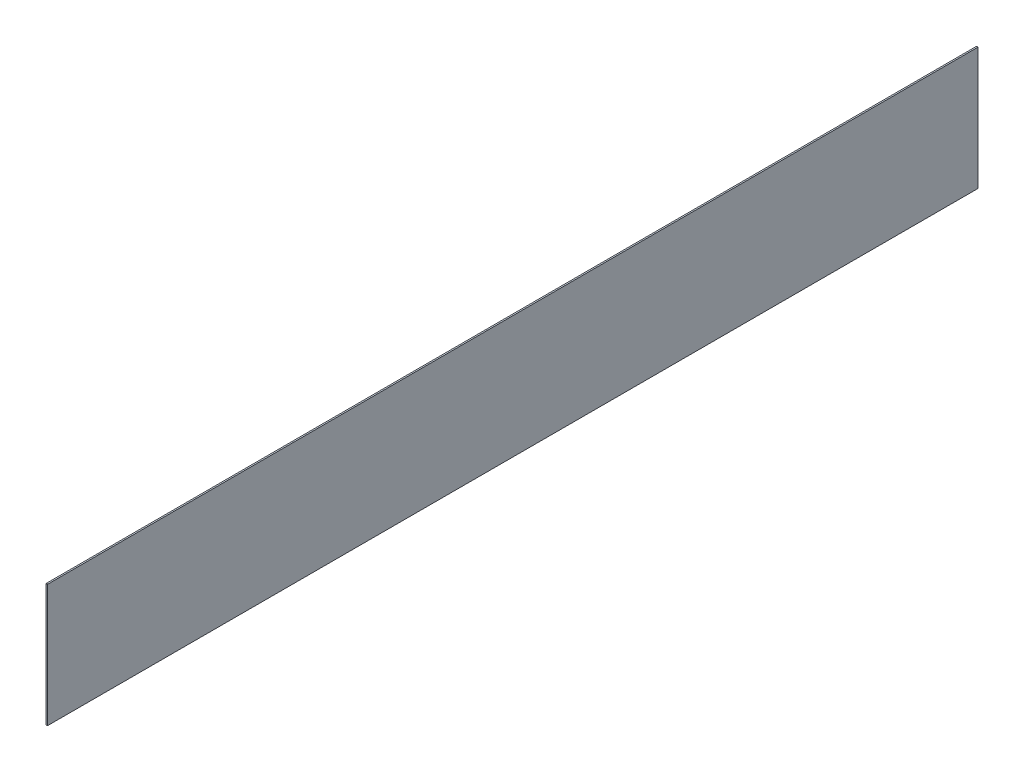
ISO-10303-21;
HEADER;
FILE_DESCRIPTION(('STEP AP214'),'2;1');
FILE_NAME('part.step','',(''),(''),'','','');
FILE_SCHEMA(('AUTOMOTIVE_DESIGN { 1 0 10303 214 1 1 1 1 }'));
ENDSEC;
DATA;
#1=APPLICATION_CONTEXT('core data for automotive mechanical design processes');
#2=APPLICATION_PROTOCOL_DEFINITION('international standard','automotive_design',2000,#1);
#3=PRODUCT_CONTEXT('',#1,'mechanical');
#4=PRODUCT('Part','Part','',(#3));
#5=PRODUCT_RELATED_PRODUCT_CATEGORY('part','',(#4));
#6=PRODUCT_DEFINITION_FORMATION('','',#4);
#7=PRODUCT_DEFINITION_CONTEXT('part definition',#1,'design');
#8=PRODUCT_DEFINITION('design','',#6,#7);
#9=PRODUCT_DEFINITION_SHAPE('','',#8);
#10=(LENGTH_UNIT() NAMED_UNIT(*) SI_UNIT(.MILLI.,.METRE.));
#11=(NAMED_UNIT(*) PLANE_ANGLE_UNIT() SI_UNIT($,.RADIAN.));
#12=(NAMED_UNIT(*) SI_UNIT($,.STERADIAN.) SOLID_ANGLE_UNIT());
#13=UNCERTAINTY_MEASURE_WITH_UNIT(LENGTH_MEASURE(1.E-05),#10,'distance_accuracy_value','');
#14=(GEOMETRIC_REPRESENTATION_CONTEXT(3) GLOBAL_UNCERTAINTY_ASSIGNED_CONTEXT((#13)) GLOBAL_UNIT_ASSIGNED_CONTEXT((#10,
#11,#12)) REPRESENTATION_CONTEXT('',''));
#15=CARTESIAN_POINT('',(0.,0.,0.));
#16=DIRECTION('',(0.,0.,1.));
#17=DIRECTION('',(1.,0.,0.));
#18=AXIS2_PLACEMENT_3D('',#15,#16,#17);
#19=CARTESIAN_POINT('',(-95.25,-60.325,-742.95457183542));
#20=DIRECTION('',(-1.,0.,0.));
#21=DIRECTION('',(0.,0.,1.));
#22=AXIS2_PLACEMENT_3D('',#19,#20,#21);
#23=PLANE('',#22);
#24=DIRECTION('',(0.,0.,1.));
#25=VECTOR('',#24,1.);
#26=CARTESIAN_POINT('',(-95.25,-60.325,-742.95457183542));
#27=LINE('',#26,#25);
#28=CARTESIAN_POINT('',(-95.25,-60.325,-679.45));
#29=VERTEX_POINT('',#28);
#30=CARTESIAN_POINT('',(-95.25,-60.325,-196.85));
#31=VERTEX_POINT('',#30);
#32=EDGE_CURVE('E11',#29,#31,#27,.T.);
#33=ORIENTED_EDGE('',*,*,#32,.F.);
#34=DIRECTION('',(0.,1.,0.));
#35=VECTOR('',#34,1.);
#36=CARTESIAN_POINT('',(-95.25,-60.325,-679.45));
#37=LINE('',#36,#35);
#38=CARTESIAN_POINT('',(-95.25,-123.825,-679.45));
#39=VERTEX_POINT('',#38);
#40=EDGE_CURVE('E76',#39,#29,#37,.T.);
#41=ORIENTED_EDGE('',*,*,#40,.F.);
#42=DIRECTION('',(0.,0.,1.));
#43=VECTOR('',#42,1.);
#44=CARTESIAN_POINT('',(-95.25,-123.825,-742.95457183542));
#45=LINE('',#44,#43);
#46=CARTESIAN_POINT('',(-95.25,-123.825,-196.85));
#47=VERTEX_POINT('',#46);
#48=EDGE_CURVE('E37',#39,#47,#45,.T.);
#49=ORIENTED_EDGE('',*,*,#48,.T.);
#50=DIRECTION('',(0.,-1.,0.));
#51=VECTOR('',#50,1.);
#52=CARTESIAN_POINT('',(-95.25,-60.325,-196.85));
#53=LINE('',#52,#51);
#54=EDGE_CURVE('E78',#31,#47,#53,.T.);
#55=ORIENTED_EDGE('',*,*,#54,.F.);
#56=EDGE_LOOP('',(#33,#41,#49,#55));
#57=FACE_BOUND('',#56,.T.);
#58=ADVANCED_FACE('F34',(#57),#23,.T.);
#59=CARTESIAN_POINT('',(-95.25,-60.325,-742.95457183542));
#60=DIRECTION('',(0.,-1.,0.));
#61=DIRECTION('',(0.,0.,-1.));
#62=AXIS2_PLACEMENT_3D('',#59,#60,#61);
#63=PLANE('',#62);
#64=DIRECTION('',(-1.,0.,0.));
#65=VECTOR('',#64,1.);
#66=CARTESIAN_POINT('',(-95.25,-60.325,-679.45));
#67=LINE('',#66,#65);
#68=CARTESIAN_POINT('',(-94.488,-60.325,-679.45));
#69=VERTEX_POINT('',#68);
#70=EDGE_CURVE('E73',#29,#69,#67,.F.);
#71=ORIENTED_EDGE('',*,*,#70,.F.);
#72=ORIENTED_EDGE('',*,*,#32,.T.);
#73=DIRECTION('',(1.,0.,0.));
#74=VECTOR('',#73,1.);
#75=CARTESIAN_POINT('',(-95.25,-60.325,-196.85));
#76=LINE('',#75,#74);
#77=CARTESIAN_POINT('',(-94.488,-60.325,-196.85));
#78=VERTEX_POINT('',#77);
#79=EDGE_CURVE('E88',#31,#78,#76,.T.);
#80=ORIENTED_EDGE('',*,*,#79,.T.);
#81=DIRECTION('',(0.,0.,1.));
#82=VECTOR('',#81,1.);
#83=CARTESIAN_POINT('',(-94.488,-60.325,-742.95457183542));
#84=LINE('',#83,#82);
#85=EDGE_CURVE('E42',#69,#78,#84,.T.);
#86=ORIENTED_EDGE('',*,*,#85,.F.);
#87=EDGE_LOOP('',(#71,#72,#80,#86));
#88=FACE_BOUND('',#87,.T.);
#89=ADVANCED_FACE('F87',(#88),#63,.F.);
#90=CARTESIAN_POINT('',(-94.488,-60.325,-742.95457183542));
#91=DIRECTION('',(-1.,0.,0.));
#92=DIRECTION('',(0.,0.,1.));
#93=AXIS2_PLACEMENT_3D('',#90,#91,#92);
#94=PLANE('',#93);
#95=DIRECTION('',(0.,1.,0.));
#96=VECTOR('',#95,1.);
#97=CARTESIAN_POINT('',(-94.488,-60.325,-679.45));
#98=LINE('',#97,#96);
#99=CARTESIAN_POINT('',(-94.488,-123.825,-679.45));
#100=VERTEX_POINT('',#99);
#101=EDGE_CURVE('E50',#100,#69,#98,.T.);
#102=ORIENTED_EDGE('',*,*,#101,.T.);
#103=ORIENTED_EDGE('',*,*,#85,.T.);
#104=DIRECTION('',(0.,1.,0.));
#105=VECTOR('',#104,1.);
#106=CARTESIAN_POINT('',(-94.488,-60.325,-196.85));
#107=LINE('',#106,#105);
#108=CARTESIAN_POINT('',(-94.488,-123.825,-196.85));
#109=VERTEX_POINT('',#108);
#110=EDGE_CURVE('E93',#78,#109,#107,.F.);
#111=ORIENTED_EDGE('',*,*,#110,.T.);
#112=DIRECTION('',(0.,0.,1.));
#113=VECTOR('',#112,1.);
#114=CARTESIAN_POINT('',(-94.488,-123.825,-742.95457183542));
#115=LINE('',#114,#113);
#116=EDGE_CURVE('E85',#100,#109,#115,.T.);
#117=ORIENTED_EDGE('',*,*,#116,.F.);
#118=EDGE_LOOP('',(#102,#103,#111,#117));
#119=FACE_BOUND('',#118,.T.);
#120=ADVANCED_FACE('F83',(#119),#94,.F.);
#121=CARTESIAN_POINT('',(-94.488,-123.825,-742.95457183542));
#122=DIRECTION('',(0.,1.,0.));
#123=DIRECTION('',(-1.,0.,0.));
#124=AXIS2_PLACEMENT_3D('',#121,#122,#123);
#125=PLANE('',#124);
#126=DIRECTION('',(-1.,0.,0.));
#127=VECTOR('',#126,1.);
#128=CARTESIAN_POINT('',(-95.25,-123.825,-679.45));
#129=LINE('',#128,#127);
#130=EDGE_CURVE('E79',#39,#100,#129,.F.);
#131=ORIENTED_EDGE('',*,*,#130,.T.);
#132=ORIENTED_EDGE('',*,*,#116,.T.);
#133=DIRECTION('',(-1.,0.,0.));
#134=VECTOR('',#133,1.);
#135=CARTESIAN_POINT('',(-94.488,-123.825,-196.85));
#136=LINE('',#135,#134);
#137=EDGE_CURVE('E95',#109,#47,#136,.T.);
#138=ORIENTED_EDGE('',*,*,#137,.T.);
#139=ORIENTED_EDGE('',*,*,#48,.F.);
#140=EDGE_LOOP('',(#131,#132,#138,#139));
#141=FACE_BOUND('',#140,.T.);
#142=ADVANCED_FACE('F103',(#141),#125,.F.);
#143=CARTESIAN_POINT('',(0.,0.,-196.85));
#144=DIRECTION('',(0.,0.,-1.));
#145=DIRECTION('',(-1.,0.,0.));
#146=AXIS2_PLACEMENT_3D('',#143,#144,#145);
#147=PLANE('',#146);
#148=ORIENTED_EDGE('',*,*,#54,.T.);
#149=ORIENTED_EDGE('',*,*,#137,.F.);
#150=ORIENTED_EDGE('',*,*,#110,.F.);
#151=ORIENTED_EDGE('',*,*,#79,.F.);
#152=EDGE_LOOP('',(#148,#149,#150,#151));
#153=FACE_BOUND('',#152,.T.);
#154=ADVANCED_FACE('F108',(#153),#147,.F.);
#155=CARTESIAN_POINT('',(-95.25,-60.325,-679.45));
#156=DIRECTION('',(0.,0.,1.));
#157=DIRECTION('',(0.,1.,0.));
#158=AXIS2_PLACEMENT_3D('',#155,#156,#157);
#159=PLANE('',#158);
#160=ORIENTED_EDGE('',*,*,#40,.T.);
#161=ORIENTED_EDGE('',*,*,#70,.T.);
#162=ORIENTED_EDGE('',*,*,#101,.F.);
#163=ORIENTED_EDGE('',*,*,#130,.F.);
#164=EDGE_LOOP('',(#160,#161,#162,#163));
#165=FACE_BOUND('',#164,.T.);
#166=ADVANCED_FACE('F74',(#165),#159,.F.);
#167=CLOSED_SHELL('',(#58,#89,#120,#142,#154,#166));
#168=MANIFOLD_SOLID_BREP('B2',#167);
#169=ADVANCED_BREP_SHAPE_REPRESENTATION('',(#18,#168),#14);
#170=SHAPE_DEFINITION_REPRESENTATION(#9,#169);
ENDSEC;
END-ISO-10303-21;
